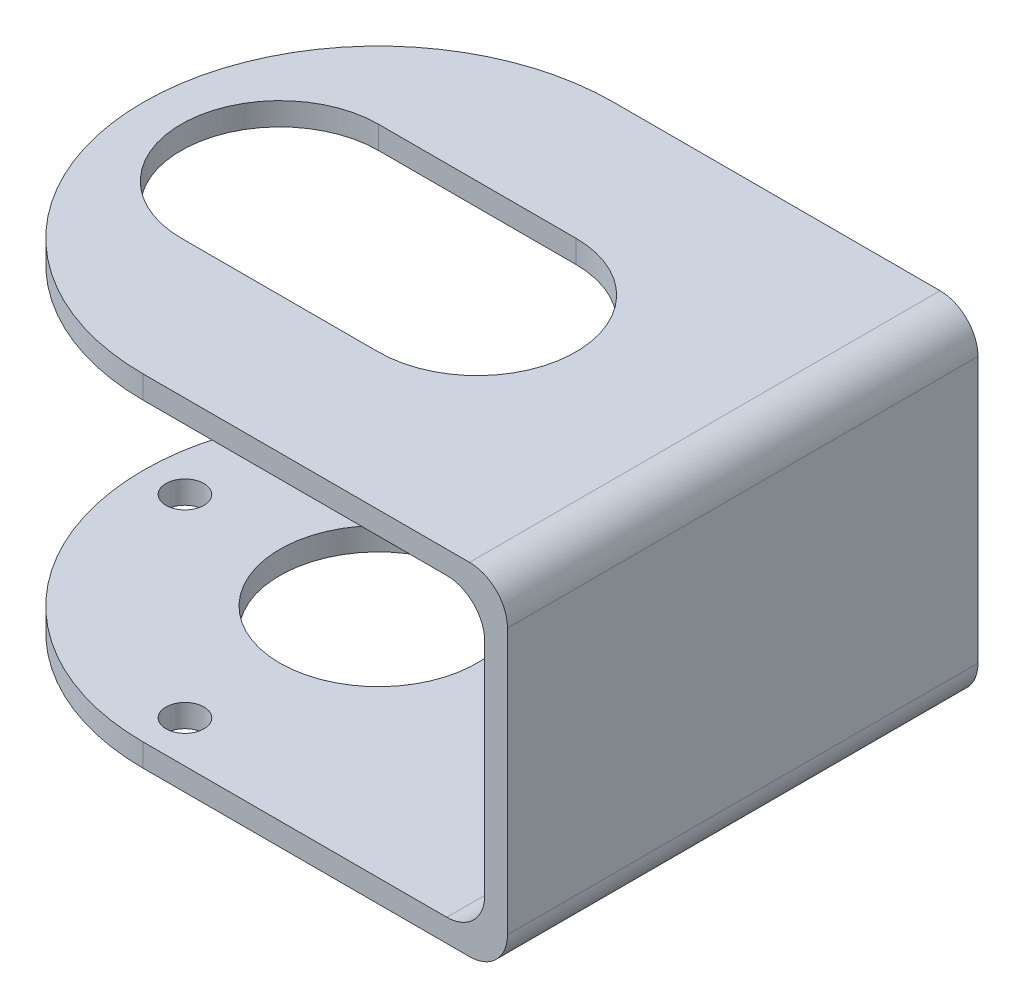
ISO-10303-21;
HEADER;
FILE_DESCRIPTION(('STEP AP214'),'2;1');
FILE_NAME('part.step','',(''),(''),'','','');
FILE_SCHEMA(('AUTOMOTIVE_DESIGN { 1 0 10303 214 1 1 1 1 }'));
ENDSEC;
DATA;
#1=APPLICATION_CONTEXT('core data for automotive mechanical design processes');
#2=APPLICATION_PROTOCOL_DEFINITION('international standard','automotive_design',2000,#1);
#3=PRODUCT_CONTEXT('',#1,'mechanical');
#4=PRODUCT('Part','Part','',(#3));
#5=PRODUCT_RELATED_PRODUCT_CATEGORY('part','',(#4));
#6=PRODUCT_DEFINITION_FORMATION('','',#4);
#7=PRODUCT_DEFINITION_CONTEXT('part definition',#1,'design');
#8=PRODUCT_DEFINITION('design','',#6,#7);
#9=PRODUCT_DEFINITION_SHAPE('','',#8);
#10=(LENGTH_UNIT() NAMED_UNIT(*) SI_UNIT(.MILLI.,.METRE.));
#11=(NAMED_UNIT(*) PLANE_ANGLE_UNIT() SI_UNIT($,.RADIAN.));
#12=(NAMED_UNIT(*) SI_UNIT($,.STERADIAN.) SOLID_ANGLE_UNIT());
#13=UNCERTAINTY_MEASURE_WITH_UNIT(LENGTH_MEASURE(1.E-05),#10,'distance_accuracy_value','');
#14=(GEOMETRIC_REPRESENTATION_CONTEXT(3) GLOBAL_UNCERTAINTY_ASSIGNED_CONTEXT((#13)) GLOBAL_UNIT_ASSIGNED_CONTEXT((#10,
#11,#12)) REPRESENTATION_CONTEXT('',''));
#15=CARTESIAN_POINT('',(0.,0.,0.));
#16=DIRECTION('',(0.,0.,1.));
#17=DIRECTION('',(1.,0.,0.));
#18=AXIS2_PLACEMENT_3D('',#15,#16,#17);
#19=CARTESIAN_POINT('',(45.,0.,0.));
#20=DIRECTION('',(-1.,0.,0.));
#21=DIRECTION('',(0.,0.,1.));
#22=AXIS2_PLACEMENT_3D('',#19,#20,#21);
#23=PLANE('',#22);
#24=DIRECTION('',(0.,1.,0.));
#25=VECTOR('',#24,1.);
#26=CARTESIAN_POINT('',(45.,0.,-31.));
#27=LINE('',#26,#25);
#28=CARTESIAN_POINT('',(45.,8.,-31.));
#29=VERTEX_POINT('',#28);
#30=CARTESIAN_POINT('',(45.,37.,-31.));
#31=VERTEX_POINT('',#30);
#32=EDGE_CURVE('E210',#29,#31,#27,.T.);
#33=ORIENTED_EDGE('',*,*,#32,.F.);
#34=DIRECTION('',(0.,0.,-1.));
#35=VECTOR('',#34,1.);
#36=CARTESIAN_POINT('',(45.,8.,31.));
#37=LINE('',#36,#35);
#38=CARTESIAN_POINT('',(45.,8.,31.));
#39=VERTEX_POINT('',#38);
#40=EDGE_CURVE('E61',#29,#39,#37,.F.);
#41=ORIENTED_EDGE('',*,*,#40,.T.);
#42=DIRECTION('',(0.,-1.,0.));
#43=VECTOR('',#42,1.);
#44=CARTESIAN_POINT('',(45.,0.,31.));
#45=LINE('',#44,#43);
#46=CARTESIAN_POINT('',(45.,37.,31.));
#47=VERTEX_POINT('',#46);
#48=EDGE_CURVE('E205',#47,#39,#45,.T.);
#49=ORIENTED_EDGE('',*,*,#48,.F.);
#50=DIRECTION('',(0.,0.,1.));
#51=VECTOR('',#50,1.);
#52=CARTESIAN_POINT('',(45.,37.,0.));
#53=LINE('',#52,#51);
#54=EDGE_CURVE('E290',#47,#31,#53,.F.);
#55=ORIENTED_EDGE('',*,*,#54,.T.);
#56=EDGE_LOOP('',(#33,#41,#49,#55));
#57=FACE_BOUND('',#56,.T.);
#58=ADVANCED_FACE('F38',(#57),#23,.T.);
#59=CARTESIAN_POINT('',(0.,3.,0.));
#60=DIRECTION('',(0.,1.,0.));
#61=DIRECTION('',(0.,0.,1.));
#62=AXIS2_PLACEMENT_3D('',#59,#60,#61);
#63=PLANE('',#62);
#64=CARTESIAN_POINT('',(0.,3.,25.5));
#65=DIRECTION('',(0.,1.,0.));
#66=DIRECTION('',(0.,0.,1.));
#67=AXIS2_PLACEMENT_3D('',#64,#65,#66);
#68=CIRCLE('',#67,2.5);
#69=CARTESIAN_POINT('',(0.,3.,28.));
#70=VERTEX_POINT('',#69);
#71=EDGE_CURVE('E227',#70,#70,#68,.T.);
#72=ORIENTED_EDGE('',*,*,#71,.F.);
#73=EDGE_LOOP('',(#72));
#74=FACE_BOUND('',#73,.T.);
#75=CARTESIAN_POINT('',(0.,3.,-25.5));
#76=DIRECTION('',(0.,1.,0.));
#77=DIRECTION('',(0.,0.,1.));
#78=AXIS2_PLACEMENT_3D('',#75,#76,#77);
#79=CIRCLE('',#78,2.5);
#80=CARTESIAN_POINT('',(0.,3.,-23.));
#81=VERTEX_POINT('',#80);
#82=EDGE_CURVE('E239',#81,#81,#79,.T.);
#83=ORIENTED_EDGE('',*,*,#82,.F.);
#84=EDGE_LOOP('',(#83));
#85=FACE_BOUND('',#84,.T.);
#86=DIRECTION('',(1.,0.,0.));
#87=VECTOR('',#86,1.);
#88=CARTESIAN_POINT('',(45.,3.,31.));
#89=LINE('',#88,#87);
#90=CARTESIAN_POINT('',(0.,3.,31.));
#91=VERTEX_POINT('',#90);
#92=CARTESIAN_POINT('',(40.,3.,31.));
#93=VERTEX_POINT('',#92);
#94=EDGE_CURVE('E254',#91,#93,#89,.T.);
#95=ORIENTED_EDGE('',*,*,#94,.T.);
#96=DIRECTION('',(0.,0.,-1.));
#97=VECTOR('',#96,1.);
#98=CARTESIAN_POINT('',(40.,3.,-31.));
#99=LINE('',#98,#97);
#100=CARTESIAN_POINT('',(40.,3.,-31.));
#101=VERTEX_POINT('',#100);
#102=EDGE_CURVE('E287',#93,#101,#99,.T.);
#103=ORIENTED_EDGE('',*,*,#102,.T.);
#104=DIRECTION('',(-1.,0.,0.));
#105=VECTOR('',#104,1.);
#106=CARTESIAN_POINT('',(0.,3.,-31.));
#107=LINE('',#106,#105);
#108=CARTESIAN_POINT('',(0.,3.,-31.));
#109=VERTEX_POINT('',#108);
#110=EDGE_CURVE('E257',#101,#109,#107,.T.);
#111=ORIENTED_EDGE('',*,*,#110,.T.);
#112=CARTESIAN_POINT('',(0.,3.,0.));
#113=DIRECTION('',(0.,1.,0.));
#114=DIRECTION('',(0.,0.,1.));
#115=AXIS2_PLACEMENT_3D('',#112,#113,#114);
#116=CIRCLE('',#115,31.);
#117=EDGE_CURVE('E251',#109,#91,#116,.T.);
#118=ORIENTED_EDGE('',*,*,#117,.T.);
#119=EDGE_LOOP('',(#95,#103,#111,#118));
#120=FACE_BOUND('',#119,.T.);
#121=CARTESIAN_POINT('',(0.,3.,0.));
#122=DIRECTION('',(0.,1.,0.));
#123=DIRECTION('',(0.,0.,1.));
#124=AXIS2_PLACEMENT_3D('',#121,#122,#123);
#125=CIRCLE('',#124,13.);
#126=CARTESIAN_POINT('',(0.,3.,13.));
#127=VERTEX_POINT('',#126);
#128=EDGE_CURVE('E245',#127,#127,#125,.T.);
#129=ORIENTED_EDGE('',*,*,#128,.F.);
#130=EDGE_LOOP('',(#129));
#131=FACE_BOUND('',#130,.T.);
#132=CARTESIAN_POINT('',(-25.5,3.,0.));
#133=DIRECTION('',(0.,1.,0.));
#134=DIRECTION('',(0.,0.,1.));
#135=AXIS2_PLACEMENT_3D('',#132,#133,#134);
#136=CIRCLE('',#135,2.5);
#137=CARTESIAN_POINT('',(-25.5,3.,2.5));
#138=VERTEX_POINT('',#137);
#139=EDGE_CURVE('E233',#138,#138,#136,.T.);
#140=ORIENTED_EDGE('',*,*,#139,.F.);
#141=EDGE_LOOP('',(#140));
#142=FACE_BOUND('',#141,.T.);
#143=CARTESIAN_POINT('',(25.5,3.,0.));
#144=DIRECTION('',(0.,1.,0.));
#145=DIRECTION('',(0.,0.,1.));
#146=AXIS2_PLACEMENT_3D('',#143,#144,#145);
#147=CIRCLE('',#146,2.5);
#148=CARTESIAN_POINT('',(25.5,3.,2.5));
#149=VERTEX_POINT('',#148);
#150=EDGE_CURVE('E221',#149,#149,#147,.T.);
#151=ORIENTED_EDGE('',*,*,#150,.F.);
#152=EDGE_LOOP('',(#151));
#153=FACE_BOUND('',#152,.T.);
#154=ADVANCED_FACE('F342',(#74,#85,#120,#131,#142,#153),#63,.T.);
#155=CARTESIAN_POINT('',(0.,0.,0.));
#156=DIRECTION('',(0.,1.,0.));
#157=DIRECTION('',(0.,0.,1.));
#158=AXIS2_PLACEMENT_3D('',#155,#156,#157);
#159=PLANE('',#158);
#160=DIRECTION('',(-1.,0.,0.));
#161=VECTOR('',#160,1.);
#162=CARTESIAN_POINT('',(0.,0.,-31.));
#163=LINE('',#162,#161);
#164=CARTESIAN_POINT('',(43.,0.,-31.));
#165=VERTEX_POINT('',#164);
#166=CARTESIAN_POINT('',(0.,0.,-31.));
#167=VERTEX_POINT('',#166);
#168=EDGE_CURVE('E255',#165,#167,#163,.T.);
#169=ORIENTED_EDGE('',*,*,#168,.F.);
#170=DIRECTION('',(0.,0.,-1.));
#171=VECTOR('',#170,1.);
#172=CARTESIAN_POINT('',(43.,0.,0.));
#173=LINE('',#172,#171);
#174=CARTESIAN_POINT('',(43.,0.,31.));
#175=VERTEX_POINT('',#174);
#176=EDGE_CURVE('E281',#165,#175,#173,.F.);
#177=ORIENTED_EDGE('',*,*,#176,.T.);
#178=DIRECTION('',(1.,0.,0.));
#179=VECTOR('',#178,1.);
#180=CARTESIAN_POINT('',(45.,0.,31.));
#181=LINE('',#180,#179);
#182=CARTESIAN_POINT('',(0.,0.,31.));
#183=VERTEX_POINT('',#182);
#184=EDGE_CURVE('E262',#183,#175,#181,.T.);
#185=ORIENTED_EDGE('',*,*,#184,.F.);
#186=CARTESIAN_POINT('',(0.,0.,0.));
#187=DIRECTION('',(0.,1.,0.));
#188=DIRECTION('',(0.,0.,1.));
#189=AXIS2_PLACEMENT_3D('',#186,#187,#188);
#190=CIRCLE('',#189,31.);
#191=EDGE_CURVE('E248',#167,#183,#190,.T.);
#192=ORIENTED_EDGE('',*,*,#191,.F.);
#193=EDGE_LOOP('',(#169,#177,#185,#192));
#194=FACE_BOUND('',#193,.T.);
#195=CARTESIAN_POINT('',(0.,0.,0.));
#196=DIRECTION('',(0.,1.,0.));
#197=DIRECTION('',(0.,0.,1.));
#198=AXIS2_PLACEMENT_3D('',#195,#196,#197);
#199=CIRCLE('',#198,13.);
#200=CARTESIAN_POINT('',(0.,0.,13.));
#201=VERTEX_POINT('',#200);
#202=EDGE_CURVE('E242',#201,#201,#199,.T.);
#203=ORIENTED_EDGE('',*,*,#202,.T.);
#204=EDGE_LOOP('',(#203));
#205=FACE_BOUND('',#204,.T.);
#206=CARTESIAN_POINT('',(0.,0.,-25.5));
#207=DIRECTION('',(0.,1.,0.));
#208=DIRECTION('',(0.,0.,1.));
#209=AXIS2_PLACEMENT_3D('',#206,#207,#208);
#210=CIRCLE('',#209,2.5);
#211=CARTESIAN_POINT('',(0.,0.,-23.));
#212=VERTEX_POINT('',#211);
#213=EDGE_CURVE('E236',#212,#212,#210,.T.);
#214=ORIENTED_EDGE('',*,*,#213,.T.);
#215=EDGE_LOOP('',(#214));
#216=FACE_BOUND('',#215,.T.);
#217=CARTESIAN_POINT('',(-25.5,0.,0.));
#218=DIRECTION('',(0.,1.,0.));
#219=DIRECTION('',(0.,0.,1.));
#220=AXIS2_PLACEMENT_3D('',#217,#218,#219);
#221=CIRCLE('',#220,2.5);
#222=CARTESIAN_POINT('',(-25.5,0.,2.5));
#223=VERTEX_POINT('',#222);
#224=EDGE_CURVE('E230',#223,#223,#221,.T.);
#225=ORIENTED_EDGE('',*,*,#224,.T.);
#226=EDGE_LOOP('',(#225));
#227=FACE_BOUND('',#226,.T.);
#228=CARTESIAN_POINT('',(0.,0.,25.5));
#229=DIRECTION('',(0.,1.,0.));
#230=DIRECTION('',(0.,0.,1.));
#231=AXIS2_PLACEMENT_3D('',#228,#229,#230);
#232=CIRCLE('',#231,2.5);
#233=CARTESIAN_POINT('',(0.,0.,28.));
#234=VERTEX_POINT('',#233);
#235=EDGE_CURVE('E224',#234,#234,#232,.T.);
#236=ORIENTED_EDGE('',*,*,#235,.T.);
#237=EDGE_LOOP('',(#236));
#238=FACE_BOUND('',#237,.T.);
#239=CARTESIAN_POINT('',(25.5,0.,0.));
#240=DIRECTION('',(0.,1.,0.));
#241=DIRECTION('',(0.,0.,1.));
#242=AXIS2_PLACEMENT_3D('',#239,#240,#241);
#243=CIRCLE('',#242,2.5);
#244=CARTESIAN_POINT('',(25.5,0.,2.5));
#245=VERTEX_POINT('',#244);
#246=EDGE_CURVE('E220',#245,#245,#243,.T.);
#247=ORIENTED_EDGE('',*,*,#246,.T.);
#248=EDGE_LOOP('',(#247));
#249=FACE_BOUND('',#248,.T.);
#250=ADVANCED_FACE('F334',(#194,#205,#216,#227,#238,#249),#159,.F.);
#251=CARTESIAN_POINT('',(0.,3.,0.));
#252=DIRECTION('',(0.,-1.,0.));
#253=DIRECTION('',(0.,0.,-1.));
#254=AXIS2_PLACEMENT_3D('',#251,#252,#253);
#255=CYLINDRICAL_SURFACE('',#254,31.);
#256=ORIENTED_EDGE('',*,*,#191,.T.);
#257=DIRECTION('',(0.,-1.,0.));
#258=VECTOR('',#257,1.);
#259=CARTESIAN_POINT('',(0.,3.,31.));
#260=LINE('',#259,#258);
#261=EDGE_CURVE('E268',#91,#183,#260,.T.);
#262=ORIENTED_EDGE('',*,*,#261,.F.);
#263=ORIENTED_EDGE('',*,*,#117,.F.);
#264=DIRECTION('',(0.,-1.,0.));
#265=VECTOR('',#264,1.);
#266=CARTESIAN_POINT('',(0.,3.,-31.));
#267=LINE('',#266,#265);
#268=EDGE_CURVE('E259',#109,#167,#267,.T.);
#269=ORIENTED_EDGE('',*,*,#268,.T.);
#270=EDGE_LOOP('',(#256,#262,#263,#269));
#271=FACE_BOUND('',#270,.T.);
#272=ADVANCED_FACE('F338',(#271),#255,.T.);
#273=CARTESIAN_POINT('',(45.,3.,31.));
#274=DIRECTION('',(0.,0.,-1.));
#275=DIRECTION('',(-1.,0.,0.));
#276=AXIS2_PLACEMENT_3D('',#273,#274,#275);
#277=PLANE('',#276);
#278=ORIENTED_EDGE('',*,*,#184,.T.);
#279=CARTESIAN_POINT('',(43.,5.,31.));
#280=DIRECTION('',(0.,0.,-1.));
#281=DIRECTION('',(-1.,0.,0.));
#282=AXIS2_PLACEMENT_3D('',#279,#280,#281);
#283=CIRCLE('',#282,5.);
#284=CARTESIAN_POINT('',(48.,5.,31.));
#285=VERTEX_POINT('',#284);
#286=EDGE_CURVE('E285',#175,#285,#283,.F.);
#287=ORIENTED_EDGE('',*,*,#286,.T.);
#288=DIRECTION('',(0.,-1.,0.));
#289=VECTOR('',#288,1.);
#290=CARTESIAN_POINT('',(48.,0.,31.));
#291=LINE('',#290,#289);
#292=CARTESIAN_POINT('',(48.,40.,31.));
#293=VERTEX_POINT('',#292);
#294=EDGE_CURVE('E206',#293,#285,#291,.T.);
#295=ORIENTED_EDGE('',*,*,#294,.F.);
#296=CARTESIAN_POINT('',(43.,40.,31.));
#297=DIRECTION('',(0.,0.,-1.));
#298=DIRECTION('',(-1.,0.,0.));
#299=AXIS2_PLACEMENT_3D('',#296,#297,#298);
#300=CIRCLE('',#299,5.);
#301=CARTESIAN_POINT('',(43.,45.,31.));
#302=VERTEX_POINT('',#301);
#303=EDGE_CURVE('E283',#293,#302,#300,.F.);
#304=ORIENTED_EDGE('',*,*,#303,.T.);
#305=DIRECTION('',(-1.,0.,0.));
#306=VECTOR('',#305,1.);
#307=CARTESIAN_POINT('',(48.,45.,31.));
#308=LINE('',#307,#306);
#309=CARTESIAN_POINT('',(0.,45.,31.));
#310=VERTEX_POINT('',#309);
#311=EDGE_CURVE('E213',#302,#310,#308,.T.);
#312=ORIENTED_EDGE('',*,*,#311,.T.);
#313=DIRECTION('',(0.,-1.,0.));
#314=VECTOR('',#313,1.);
#315=CARTESIAN_POINT('',(0.,3.,31.));
#316=LINE('',#315,#314);
#317=CARTESIAN_POINT('',(0.,42.,31.));
#318=VERTEX_POINT('',#317);
#319=EDGE_CURVE('E192',#318,#310,#316,.F.);
#320=ORIENTED_EDGE('',*,*,#319,.F.);
#321=DIRECTION('',(1.,0.,0.));
#322=VECTOR('',#321,1.);
#323=CARTESIAN_POINT('',(-31.001,42.,31.));
#324=LINE('',#323,#322);
#325=CARTESIAN_POINT('',(40.,42.,31.));
#326=VERTEX_POINT('',#325);
#327=EDGE_CURVE('E187',#318,#326,#324,.T.);
#328=ORIENTED_EDGE('',*,*,#327,.T.);
#329=CARTESIAN_POINT('',(40.,37.,31.));
#330=DIRECTION('',(0.,0.,-1.));
#331=DIRECTION('',(-1.,0.,0.));
#332=AXIS2_PLACEMENT_3D('',#329,#330,#331);
#333=CIRCLE('',#332,5.);
#334=EDGE_CURVE('E46',#326,#47,#333,.T.);
#335=ORIENTED_EDGE('',*,*,#334,.T.);
#336=ORIENTED_EDGE('',*,*,#48,.T.);
#337=CARTESIAN_POINT('',(40.,8.,31.));
#338=DIRECTION('',(0.,0.,-1.));
#339=DIRECTION('',(-1.,0.,0.));
#340=AXIS2_PLACEMENT_3D('',#337,#338,#339);
#341=CIRCLE('',#340,5.);
#342=EDGE_CURVE('E53',#39,#93,#341,.T.);
#343=ORIENTED_EDGE('',*,*,#342,.T.);
#344=ORIENTED_EDGE('',*,*,#94,.F.);
#345=ORIENTED_EDGE('',*,*,#261,.T.);
#346=EDGE_LOOP('',(#278,#287,#295,#304,#312,#320,#328,#335,#336,#343,#344,#345));
#347=FACE_BOUND('',#346,.T.);
#348=ADVANCED_FACE('F300',(#347),#277,.F.);
#349=CARTESIAN_POINT('',(0.,3.,-31.));
#350=DIRECTION('',(0.,0.,1.));
#351=DIRECTION('',(1.,0.,0.));
#352=AXIS2_PLACEMENT_3D('',#349,#350,#351);
#353=PLANE('',#352);
#354=DIRECTION('',(0.,1.,0.));
#355=VECTOR('',#354,1.);
#356=CARTESIAN_POINT('',(48.,0.,-31.));
#357=LINE('',#356,#355);
#358=CARTESIAN_POINT('',(48.,5.,-31.));
#359=VERTEX_POINT('',#358);
#360=CARTESIAN_POINT('',(48.,40.,-31.));
#361=VERTEX_POINT('',#360);
#362=EDGE_CURVE('E209',#359,#361,#357,.T.);
#363=ORIENTED_EDGE('',*,*,#362,.F.);
#364=CARTESIAN_POINT('',(43.,5.,-31.));
#365=DIRECTION('',(0.,0.,1.));
#366=DIRECTION('',(1.,0.,0.));
#367=AXIS2_PLACEMENT_3D('',#364,#365,#366);
#368=CIRCLE('',#367,5.);
#369=EDGE_CURVE('E279',#359,#165,#368,.F.);
#370=ORIENTED_EDGE('',*,*,#369,.T.);
#371=ORIENTED_EDGE('',*,*,#168,.T.);
#372=ORIENTED_EDGE('',*,*,#268,.F.);
#373=ORIENTED_EDGE('',*,*,#110,.F.);
#374=CARTESIAN_POINT('',(40.,8.,-31.));
#375=DIRECTION('',(0.,0.,1.));
#376=DIRECTION('',(1.,0.,0.));
#377=AXIS2_PLACEMENT_3D('',#374,#375,#376);
#378=CIRCLE('',#377,5.);
#379=EDGE_CURVE('E298',#101,#29,#378,.T.);
#380=ORIENTED_EDGE('',*,*,#379,.T.);
#381=ORIENTED_EDGE('',*,*,#32,.T.);
#382=CARTESIAN_POINT('',(40.,37.,-31.));
#383=DIRECTION('',(0.,0.,1.));
#384=DIRECTION('',(1.,0.,0.));
#385=AXIS2_PLACEMENT_3D('',#382,#383,#384);
#386=CIRCLE('',#385,5.);
#387=CARTESIAN_POINT('',(40.,42.,-31.));
#388=VERTEX_POINT('',#387);
#389=EDGE_CURVE('E11',#31,#388,#386,.T.);
#390=ORIENTED_EDGE('',*,*,#389,.T.);
#391=DIRECTION('',(1.,0.,0.));
#392=VECTOR('',#391,1.);
#393=CARTESIAN_POINT('',(-31.001,42.,-31.));
#394=LINE('',#393,#392);
#395=CARTESIAN_POINT('',(0.,42.,-31.));
#396=VERTEX_POINT('',#395);
#397=EDGE_CURVE('E195',#396,#388,#394,.T.);
#398=ORIENTED_EDGE('',*,*,#397,.F.);
#399=DIRECTION('',(0.,-1.,0.));
#400=VECTOR('',#399,1.);
#401=CARTESIAN_POINT('',(0.,3.,-31.));
#402=LINE('',#401,#400);
#403=CARTESIAN_POINT('',(0.,45.,-31.));
#404=VERTEX_POINT('',#403);
#405=EDGE_CURVE('E191',#396,#404,#402,.F.);
#406=ORIENTED_EDGE('',*,*,#405,.T.);
#407=DIRECTION('',(-1.,0.,0.));
#408=VECTOR('',#407,1.);
#409=CARTESIAN_POINT('',(48.,45.,-31.));
#410=LINE('',#409,#408);
#411=CARTESIAN_POINT('',(43.,45.,-31.));
#412=VERTEX_POINT('',#411);
#413=EDGE_CURVE('E218',#412,#404,#410,.T.);
#414=ORIENTED_EDGE('',*,*,#413,.F.);
#415=CARTESIAN_POINT('',(43.,40.,-31.));
#416=DIRECTION('',(0.,0.,1.));
#417=DIRECTION('',(1.,0.,0.));
#418=AXIS2_PLACEMENT_3D('',#415,#416,#417);
#419=CIRCLE('',#418,5.);
#420=EDGE_CURVE('E277',#412,#361,#419,.F.);
#421=ORIENTED_EDGE('',*,*,#420,.T.);
#422=EDGE_LOOP('',(#363,#370,#371,#372,#373,#380,#381,#390,#398,#406,#414,#421));
#423=FACE_BOUND('',#422,.T.);
#424=ADVANCED_FACE('F310',(#423),#353,.F.);
#425=CARTESIAN_POINT('',(0.,3.,0.));
#426=DIRECTION('',(0.,-1.,0.));
#427=DIRECTION('',(0.,0.,-1.));
#428=AXIS2_PLACEMENT_3D('',#425,#426,#427);
#429=CYLINDRICAL_SURFACE('',#428,13.);
#430=ORIENTED_EDGE('',*,*,#128,.T.);
#431=EDGE_LOOP('',(#430));
#432=FACE_BOUND('',#431,.T.);
#433=ORIENTED_EDGE('',*,*,#202,.F.);
#434=EDGE_LOOP('',(#433));
#435=FACE_BOUND('',#434,.T.);
#436=ADVANCED_FACE('F383',(#432,#435),#429,.F.);
#437=CARTESIAN_POINT('',(0.,3.,-25.5));
#438=DIRECTION('',(0.,-1.,0.));
#439=DIRECTION('',(0.,0.,-1.));
#440=AXIS2_PLACEMENT_3D('',#437,#438,#439);
#441=CYLINDRICAL_SURFACE('',#440,2.5);
#442=ORIENTED_EDGE('',*,*,#82,.T.);
#443=EDGE_LOOP('',(#442));
#444=FACE_BOUND('',#443,.T.);
#445=ORIENTED_EDGE('',*,*,#213,.F.);
#446=EDGE_LOOP('',(#445));
#447=FACE_BOUND('',#446,.T.);
#448=ADVANCED_FACE('F379',(#444,#447),#441,.F.);
#449=CARTESIAN_POINT('',(-25.5,3.,0.));
#450=DIRECTION('',(0.,-1.,0.));
#451=DIRECTION('',(0.,0.,-1.));
#452=AXIS2_PLACEMENT_3D('',#449,#450,#451);
#453=CYLINDRICAL_SURFACE('',#452,2.5);
#454=ORIENTED_EDGE('',*,*,#139,.T.);
#455=EDGE_LOOP('',(#454));
#456=FACE_BOUND('',#455,.T.);
#457=ORIENTED_EDGE('',*,*,#224,.F.);
#458=EDGE_LOOP('',(#457));
#459=FACE_BOUND('',#458,.T.);
#460=ADVANCED_FACE('F375',(#456,#459),#453,.F.);
#461=CARTESIAN_POINT('',(0.,3.,25.5));
#462=DIRECTION('',(0.,-1.,0.));
#463=DIRECTION('',(0.,0.,-1.));
#464=AXIS2_PLACEMENT_3D('',#461,#462,#463);
#465=CYLINDRICAL_SURFACE('',#464,2.5);
#466=ORIENTED_EDGE('',*,*,#71,.T.);
#467=EDGE_LOOP('',(#466));
#468=FACE_BOUND('',#467,.T.);
#469=ORIENTED_EDGE('',*,*,#235,.F.);
#470=EDGE_LOOP('',(#469));
#471=FACE_BOUND('',#470,.T.);
#472=ADVANCED_FACE('F371',(#468,#471),#465,.F.);
#473=CARTESIAN_POINT('',(25.5,3.,0.));
#474=DIRECTION('',(0.,-1.,0.));
#475=DIRECTION('',(0.,0.,-1.));
#476=AXIS2_PLACEMENT_3D('',#473,#474,#475);
#477=CYLINDRICAL_SURFACE('',#476,2.5);
#478=ORIENTED_EDGE('',*,*,#150,.T.);
#479=EDGE_LOOP('',(#478));
#480=FACE_BOUND('',#479,.T.);
#481=ORIENTED_EDGE('',*,*,#246,.F.);
#482=EDGE_LOOP('',(#481));
#483=FACE_BOUND('',#482,.T.);
#484=ADVANCED_FACE('F367',(#480,#483),#477,.F.);
#485=CARTESIAN_POINT('',(48.,45.,31.));
#486=DIRECTION('',(0.,-1.,0.));
#487=DIRECTION('',(0.,0.,-1.));
#488=AXIS2_PLACEMENT_3D('',#485,#486,#487);
#489=PLANE('',#488);
#490=CARTESIAN_POINT('',(-13.,45.,0.));
#491=DIRECTION('',(0.,1.,0.));
#492=DIRECTION('',(0.,0.,1.));
#493=AXIS2_PLACEMENT_3D('',#490,#491,#492);
#494=CIRCLE('',#493,13.);
#495=CARTESIAN_POINT('',(-13.,45.,-13.));
#496=VERTEX_POINT('',#495);
#497=CARTESIAN_POINT('',(-13.,45.,13.));
#498=VERTEX_POINT('',#497);
#499=EDGE_CURVE('E569',#496,#498,#494,.T.);
#500=ORIENTED_EDGE('',*,*,#499,.F.);
#501=DIRECTION('',(-1.,0.,0.));
#502=VECTOR('',#501,1.);
#503=CARTESIAN_POINT('',(13.,45.,-13.));
#504=LINE('',#503,#502);
#505=CARTESIAN_POINT('',(13.,45.,-13.));
#506=VERTEX_POINT('',#505);
#507=EDGE_CURVE('E571',#506,#496,#504,.T.);
#508=ORIENTED_EDGE('',*,*,#507,.F.);
#509=CARTESIAN_POINT('',(13.,45.,0.));
#510=DIRECTION('',(0.,1.,0.));
#511=DIRECTION('',(0.,0.,1.));
#512=AXIS2_PLACEMENT_3D('',#509,#510,#511);
#513=CIRCLE('',#512,13.);
#514=CARTESIAN_POINT('',(13.,45.,13.));
#515=VERTEX_POINT('',#514);
#516=EDGE_CURVE('E179',#515,#506,#513,.T.);
#517=ORIENTED_EDGE('',*,*,#516,.F.);
#518=DIRECTION('',(1.,0.,0.));
#519=VECTOR('',#518,1.);
#520=CARTESIAN_POINT('',(13.,45.,13.));
#521=LINE('',#520,#519);
#522=EDGE_CURVE('E159',#498,#515,#521,.T.);
#523=ORIENTED_EDGE('',*,*,#522,.F.);
#524=EDGE_LOOP('',(#500,#508,#517,#523));
#525=FACE_BOUND('',#524,.T.);
#526=ORIENTED_EDGE('',*,*,#311,.F.);
#527=DIRECTION('',(0.,0.,1.));
#528=VECTOR('',#527,1.);
#529=CARTESIAN_POINT('',(43.,45.,31.));
#530=LINE('',#529,#528);
#531=EDGE_CURVE('E293',#302,#412,#530,.F.);
#532=ORIENTED_EDGE('',*,*,#531,.T.);
#533=ORIENTED_EDGE('',*,*,#413,.T.);
#534=CARTESIAN_POINT('',(0.,45.,0.));
#535=DIRECTION('',(0.,-1.,0.));
#536=DIRECTION('',(0.,0.,-1.));
#537=AXIS2_PLACEMENT_3D('',#534,#535,#536);
#538=CIRCLE('',#537,31.);
#539=EDGE_CURVE('E198',#404,#310,#538,.F.);
#540=ORIENTED_EDGE('',*,*,#539,.T.);
#541=EDGE_LOOP('',(#526,#532,#533,#540));
#542=FACE_BOUND('',#541,.T.);
#543=ADVANCED_FACE('F364',(#525,#542),#489,.F.);
#544=CARTESIAN_POINT('',(48.,0.,0.));
#545=DIRECTION('',(-1.,0.,0.));
#546=DIRECTION('',(0.,0.,1.));
#547=AXIS2_PLACEMENT_3D('',#544,#545,#546);
#548=PLANE('',#547);
#549=ORIENTED_EDGE('',*,*,#294,.T.);
#550=DIRECTION('',(0.,0.,-1.));
#551=VECTOR('',#550,1.);
#552=CARTESIAN_POINT('',(48.,5.,0.));
#553=LINE('',#552,#551);
#554=EDGE_CURVE('E274',#285,#359,#553,.T.);
#555=ORIENTED_EDGE('',*,*,#554,.T.);
#556=ORIENTED_EDGE('',*,*,#362,.T.);
#557=DIRECTION('',(0.,0.,1.));
#558=VECTOR('',#557,1.);
#559=CARTESIAN_POINT('',(48.,40.,0.));
#560=LINE('',#559,#558);
#561=EDGE_CURVE('E271',#361,#293,#560,.T.);
#562=ORIENTED_EDGE('',*,*,#561,.T.);
#563=EDGE_LOOP('',(#549,#555,#556,#562));
#564=FACE_BOUND('',#563,.T.);
#565=ADVANCED_FACE('F323',(#564),#548,.F.);
#566=CARTESIAN_POINT('',(-31.001,42.,-31.));
#567=DIRECTION('',(0.,1.,0.));
#568=DIRECTION('',(0.,0.,1.));
#569=AXIS2_PLACEMENT_3D('',#566,#567,#568);
#570=PLANE('',#569);
#571=CARTESIAN_POINT('',(13.,42.,0.));
#572=DIRECTION('',(0.,1.,0.));
#573=DIRECTION('',(0.,0.,1.));
#574=AXIS2_PLACEMENT_3D('',#571,#572,#573);
#575=CIRCLE('',#574,13.);
#576=CARTESIAN_POINT('',(13.,42.,-13.));
#577=VERTEX_POINT('',#576);
#578=CARTESIAN_POINT('',(13.,42.,13.));
#579=VERTEX_POINT('',#578);
#580=EDGE_CURVE('E168',#577,#579,#575,.F.);
#581=ORIENTED_EDGE('',*,*,#580,.F.);
#582=DIRECTION('',(1.,0.,0.));
#583=VECTOR('',#582,1.);
#584=CARTESIAN_POINT('',(13.,42.,-13.));
#585=LINE('',#584,#583);
#586=CARTESIAN_POINT('',(-13.,42.,-13.));
#587=VERTEX_POINT('',#586);
#588=EDGE_CURVE('E172',#587,#577,#585,.T.);
#589=ORIENTED_EDGE('',*,*,#588,.F.);
#590=CARTESIAN_POINT('',(-13.,42.,0.));
#591=DIRECTION('',(0.,1.,0.));
#592=DIRECTION('',(0.,0.,1.));
#593=AXIS2_PLACEMENT_3D('',#590,#591,#592);
#594=CIRCLE('',#593,13.);
#595=CARTESIAN_POINT('',(-13.,42.,13.));
#596=VERTEX_POINT('',#595);
#597=EDGE_CURVE('E177',#596,#587,#594,.F.);
#598=ORIENTED_EDGE('',*,*,#597,.F.);
#599=DIRECTION('',(-1.,0.,0.));
#600=VECTOR('',#599,1.);
#601=CARTESIAN_POINT('',(13.,42.,13.));
#602=LINE('',#601,#600);
#603=EDGE_CURVE('E156',#579,#596,#602,.T.);
#604=ORIENTED_EDGE('',*,*,#603,.F.);
#605=EDGE_LOOP('',(#581,#589,#598,#604));
#606=FACE_BOUND('',#605,.T.);
#607=ORIENTED_EDGE('',*,*,#397,.T.);
#608=DIRECTION('',(0.,0.,1.));
#609=VECTOR('',#608,1.);
#610=CARTESIAN_POINT('',(40.,42.,-31.));
#611=LINE('',#610,#609);
#612=EDGE_CURVE('E295',#388,#326,#611,.T.);
#613=ORIENTED_EDGE('',*,*,#612,.T.);
#614=ORIENTED_EDGE('',*,*,#327,.F.);
#615=CARTESIAN_POINT('',(0.,42.,0.));
#616=DIRECTION('',(0.,1.,0.));
#617=DIRECTION('',(0.,0.,1.));
#618=AXIS2_PLACEMENT_3D('',#615,#616,#617);
#619=CIRCLE('',#618,31.);
#620=EDGE_CURVE('E188',#318,#396,#619,.F.);
#621=ORIENTED_EDGE('',*,*,#620,.T.);
#622=EDGE_LOOP('',(#607,#613,#614,#621));
#623=FACE_BOUND('',#622,.T.);
#624=ADVANCED_FACE('F174',(#606,#623),#570,.F.);
#625=CARTESIAN_POINT('',(0.,3.,0.));
#626=DIRECTION('',(0.,-1.,0.));
#627=DIRECTION('',(0.,0.,-1.));
#628=AXIS2_PLACEMENT_3D('',#625,#626,#627);
#629=CYLINDRICAL_SURFACE('',#628,31.);
#630=ORIENTED_EDGE('',*,*,#319,.T.);
#631=ORIENTED_EDGE('',*,*,#539,.F.);
#632=ORIENTED_EDGE('',*,*,#405,.F.);
#633=ORIENTED_EDGE('',*,*,#620,.F.);
#634=EDGE_LOOP('',(#630,#631,#632,#633));
#635=FACE_BOUND('',#634,.T.);
#636=ADVANCED_FACE('F312',(#635),#629,.T.);
#637=CARTESIAN_POINT('',(13.,-0.001000000000001,-13.));
#638=DIRECTION('',(0.,0.,-1.));
#639=DIRECTION('',(-1.,0.,0.));
#640=AXIS2_PLACEMENT_3D('',#637,#638,#639);
#641=PLANE('',#640);
#642=ORIENTED_EDGE('',*,*,#588,.T.);
#643=DIRECTION('',(0.,1.,0.));
#644=VECTOR('',#643,1.);
#645=CARTESIAN_POINT('',(13.,-0.001000000000001,-13.));
#646=LINE('',#645,#644);
#647=EDGE_CURVE('E163',#577,#506,#646,.T.);
#648=ORIENTED_EDGE('',*,*,#647,.T.);
#649=ORIENTED_EDGE('',*,*,#507,.T.);
#650=DIRECTION('',(0.,1.,0.));
#651=VECTOR('',#650,1.);
#652=CARTESIAN_POINT('',(-13.,-0.001000000000001,-13.));
#653=LINE('',#652,#651);
#654=EDGE_CURVE('E184',#587,#496,#653,.T.);
#655=ORIENTED_EDGE('',*,*,#654,.F.);
#656=EDGE_LOOP('',(#642,#648,#649,#655));
#657=FACE_BOUND('',#656,.T.);
#658=ADVANCED_FACE('F448',(#657),#641,.F.);
#659=CARTESIAN_POINT('',(-13.,-0.001000000000001,0.));
#660=DIRECTION('',(0.,1.,0.));
#661=DIRECTION('',(0.,0.,1.));
#662=AXIS2_PLACEMENT_3D('',#659,#660,#661);
#663=CYLINDRICAL_SURFACE('',#662,13.);
#664=ORIENTED_EDGE('',*,*,#597,.T.);
#665=ORIENTED_EDGE('',*,*,#654,.T.);
#666=ORIENTED_EDGE('',*,*,#499,.T.);
#667=DIRECTION('',(0.,1.,0.));
#668=VECTOR('',#667,1.);
#669=CARTESIAN_POINT('',(-13.,-0.001000000000001,13.));
#670=LINE('',#669,#668);
#671=EDGE_CURVE('E164',#596,#498,#670,.T.);
#672=ORIENTED_EDGE('',*,*,#671,.F.);
#673=EDGE_LOOP('',(#664,#665,#666,#672));
#674=FACE_BOUND('',#673,.T.);
#675=ADVANCED_FACE('F455',(#674),#663,.F.);
#676=CARTESIAN_POINT('',(13.,-0.001000000000001,13.));
#677=DIRECTION('',(0.,0.,1.));
#678=DIRECTION('',(1.,0.,0.));
#679=AXIS2_PLACEMENT_3D('',#676,#677,#678);
#680=PLANE('',#679);
#681=ORIENTED_EDGE('',*,*,#603,.T.);
#682=ORIENTED_EDGE('',*,*,#671,.T.);
#683=ORIENTED_EDGE('',*,*,#522,.T.);
#684=DIRECTION('',(0.,1.,0.));
#685=VECTOR('',#684,1.);
#686=CARTESIAN_POINT('',(13.,-0.001000000000001,13.));
#687=LINE('',#686,#685);
#688=EDGE_CURVE('E152',#579,#515,#687,.T.);
#689=ORIENTED_EDGE('',*,*,#688,.F.);
#690=EDGE_LOOP('',(#681,#682,#683,#689));
#691=FACE_BOUND('',#690,.T.);
#692=ADVANCED_FACE('F154',(#691),#680,.F.);
#693=CARTESIAN_POINT('',(13.,-0.001000000000001,0.));
#694=DIRECTION('',(0.,1.,0.));
#695=DIRECTION('',(0.,0.,1.));
#696=AXIS2_PLACEMENT_3D('',#693,#694,#695);
#697=CYLINDRICAL_SURFACE('',#696,13.);
#698=ORIENTED_EDGE('',*,*,#580,.T.);
#699=ORIENTED_EDGE('',*,*,#688,.T.);
#700=ORIENTED_EDGE('',*,*,#516,.T.);
#701=ORIENTED_EDGE('',*,*,#647,.F.);
#702=EDGE_LOOP('',(#698,#699,#700,#701));
#703=FACE_BOUND('',#702,.T.);
#704=ADVANCED_FACE('F169',(#703),#697,.F.);
#705=CARTESIAN_POINT('',(43.,5.,0.));
#706=DIRECTION('',(0.,0.,-1.));
#707=DIRECTION('',(-1.,0.,0.));
#708=AXIS2_PLACEMENT_3D('',#705,#706,#707);
#709=CYLINDRICAL_SURFACE('',#708,5.);
#710=ORIENTED_EDGE('',*,*,#286,.F.);
#711=ORIENTED_EDGE('',*,*,#176,.F.);
#712=ORIENTED_EDGE('',*,*,#369,.F.);
#713=ORIENTED_EDGE('',*,*,#554,.F.);
#714=EDGE_LOOP('',(#710,#711,#712,#713));
#715=FACE_BOUND('',#714,.T.);
#716=ADVANCED_FACE('F329',(#715),#709,.T.);
#717=CARTESIAN_POINT('',(40.,8.,0.));
#718=DIRECTION('',(0.,0.,1.));
#719=DIRECTION('',(1.,0.,0.));
#720=AXIS2_PLACEMENT_3D('',#717,#718,#719);
#721=CYLINDRICAL_SURFACE('',#720,5.);
#722=ORIENTED_EDGE('',*,*,#342,.F.);
#723=ORIENTED_EDGE('',*,*,#40,.F.);
#724=ORIENTED_EDGE('',*,*,#379,.F.);
#725=ORIENTED_EDGE('',*,*,#102,.F.);
#726=EDGE_LOOP('',(#722,#723,#724,#725));
#727=FACE_BOUND('',#726,.T.);
#728=ADVANCED_FACE('F346',(#727),#721,.F.);
#729=CARTESIAN_POINT('',(43.,40.,0.));
#730=DIRECTION('',(0.,0.,1.));
#731=DIRECTION('',(1.,0.,0.));
#732=AXIS2_PLACEMENT_3D('',#729,#730,#731);
#733=CYLINDRICAL_SURFACE('',#732,5.);
#734=ORIENTED_EDGE('',*,*,#420,.F.);
#735=ORIENTED_EDGE('',*,*,#531,.F.);
#736=ORIENTED_EDGE('',*,*,#303,.F.);
#737=ORIENTED_EDGE('',*,*,#561,.F.);
#738=EDGE_LOOP('',(#734,#735,#736,#737));
#739=FACE_BOUND('',#738,.T.);
#740=ADVANCED_FACE('F320',(#739),#733,.T.);
#741=CARTESIAN_POINT('',(40.,37.,-31.));
#742=DIRECTION('',(0.,0.,1.));
#743=DIRECTION('',(1.,0.,0.));
#744=AXIS2_PLACEMENT_3D('',#741,#742,#743);
#745=CYLINDRICAL_SURFACE('',#744,5.);
#746=ORIENTED_EDGE('',*,*,#389,.F.);
#747=ORIENTED_EDGE('',*,*,#54,.F.);
#748=ORIENTED_EDGE('',*,*,#334,.F.);
#749=ORIENTED_EDGE('',*,*,#612,.F.);
#750=EDGE_LOOP('',(#746,#747,#748,#749));
#751=FACE_BOUND('',#750,.T.);
#752=ADVANCED_FACE('F40',(#751),#745,.F.);
#753=CLOSED_SHELL('',(#58,#154,#250,#272,#348,#424,#436,#448,#460,#472,#484,#543,#565,#624,#636,
#658,#675,#692,#704,#716,#728,#740,#752));
#754=MANIFOLD_SOLID_BREP('B2',#753);
#755=ADVANCED_BREP_SHAPE_REPRESENTATION('',(#18,#754),#14);
#756=SHAPE_DEFINITION_REPRESENTATION(#9,#755);
ENDSEC;
END-ISO-10303-21;
